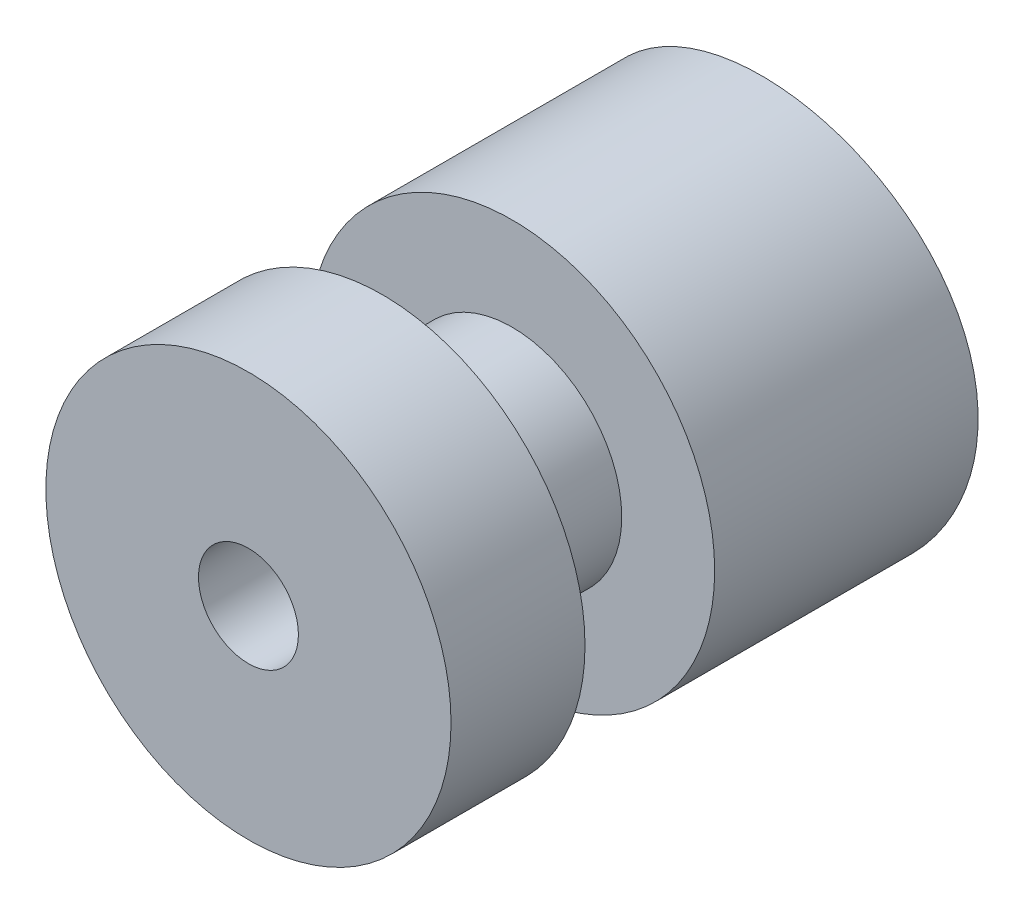
ISO-10303-21;
HEADER;
FILE_DESCRIPTION(('STEP AP214'),'2;1');
FILE_NAME('part.step','',(''),(''),'','','');
FILE_SCHEMA(('AUTOMOTIVE_DESIGN { 1 0 10303 214 1 1 1 1 }'));
ENDSEC;
DATA;
#1=APPLICATION_CONTEXT('core data for automotive mechanical design processes');
#2=APPLICATION_PROTOCOL_DEFINITION('international standard','automotive_design',2000,#1);
#3=PRODUCT_CONTEXT('',#1,'mechanical');
#4=PRODUCT('Part','Part','',(#3));
#5=PRODUCT_RELATED_PRODUCT_CATEGORY('part','',(#4));
#6=PRODUCT_DEFINITION_FORMATION('','',#4);
#7=PRODUCT_DEFINITION_CONTEXT('part definition',#1,'design');
#8=PRODUCT_DEFINITION('design','',#6,#7);
#9=PRODUCT_DEFINITION_SHAPE('','',#8);
#10=(LENGTH_UNIT() NAMED_UNIT(*) SI_UNIT(.MILLI.,.METRE.));
#11=(NAMED_UNIT(*) PLANE_ANGLE_UNIT() SI_UNIT($,.RADIAN.));
#12=(NAMED_UNIT(*) SI_UNIT($,.STERADIAN.) SOLID_ANGLE_UNIT());
#13=UNCERTAINTY_MEASURE_WITH_UNIT(LENGTH_MEASURE(1.E-05),#10,'distance_accuracy_value','');
#14=(GEOMETRIC_REPRESENTATION_CONTEXT(3) GLOBAL_UNCERTAINTY_ASSIGNED_CONTEXT((#13)) GLOBAL_UNIT_ASSIGNED_CONTEXT((#10,
#11,#12)) REPRESENTATION_CONTEXT('',''));
#15=CARTESIAN_POINT('',(0.,0.,0.));
#16=DIRECTION('',(0.,0.,1.));
#17=DIRECTION('',(1.,0.,0.));
#18=AXIS2_PLACEMENT_3D('',#15,#16,#17);
#19=CARTESIAN_POINT('',(0.,0.,24.78278));
#20=DIRECTION('',(0.,0.,-1.));
#21=DIRECTION('',(-1.,0.,0.));
#22=AXIS2_PLACEMENT_3D('',#19,#20,#21);
#23=CYLINDRICAL_SURFACE('',#22,9.525);
#24=CARTESIAN_POINT('',(-9.52499999999999,0.,0.));
#25=CARTESIAN_POINT('',(-9.52500330048905,-0.266266854005191,-1.23946684333722E-06));
#26=CARTESIAN_POINT('',(-9.51383108277556,-0.532486253668475,0.00153994071775043));
#27=CARTESIAN_POINT('',(-9.4692296761848,-1.06310273244726,0.00765771411403192));
#28=CARTESIAN_POINT('',(-9.43579559615122,-1.32749939818875,0.0122349743823779));
#29=CARTESIAN_POINT('',(-9.34687367997087,-1.85272621333056,0.0242999330053962));
#30=CARTESIAN_POINT('',(-9.2913661525161,-2.11355296258781,0.0317902298935934));
#31=CARTESIAN_POINT('',(-9.15871282916754,-2.62955630977296,0.0494644271780281));
#32=CARTESIAN_POINT('',(-9.08156668835782,-2.88473281756699,0.0596483705103974));
#33=CARTESIAN_POINT('',(-8.90627134656277,-3.38744247219539,0.0824087516421701));
#34=CARTESIAN_POINT('',(-8.80813772549415,-3.6349811338019,0.0949834139425913));
#35=CARTESIAN_POINT('',(-8.59154635824059,-4.1208872112801,0.122171539302804));
#36=CARTESIAN_POINT('',(-8.47308835424092,-4.35925451076611,0.136785028224668));
#37=CARTESIAN_POINT('',(-8.2167408639379,-4.82508545874511,0.167631338516708));
#38=CARTESIAN_POINT('',(-8.07885787775121,-5.05255272069676,0.183863617667915));
#39=CARTESIAN_POINT('',(-7.78455604814082,-5.49517682759171,0.217500132751496));
#40=CARTESIAN_POINT('',(-7.62813115682775,-5.71032962175493,0.234904750266667));
#41=CARTESIAN_POINT('',(-7.29691796939915,-6.12797308288935,0.270496229994959));
#42=CARTESIAN_POINT('',(-7.12202888699115,-6.33038349222168,0.28868702761889));
#43=CARTESIAN_POINT('',(-6.75586114837706,-6.71977620665679,0.325243053407828));
#44=CARTESIAN_POINT('',(-6.56458244059568,-6.90675846320621,0.343608282121576));
#45=CARTESIAN_POINT('',(-6.16691824199461,-7.26403510570452,0.380000665686484));
#46=CARTESIAN_POINT('',(-5.96052932874264,-7.43432569046701,0.398027742778215));
#47=CARTESIAN_POINT('',(-5.53418863768816,-7.75692043619742,0.433226659775958));
#48=CARTESIAN_POINT('',(-5.31424162948714,-7.90923086805486,0.450398796641692));
#49=CARTESIAN_POINT('',(-4.86130890845572,-8.19544772125475,0.483480548634547));
#50=CARTESIAN_POINT('',(-4.62827299833442,-8.32927536249283,0.499384644243813));
#51=CARTESIAN_POINT('',(-4.15163613550505,-8.57680921086481,0.529399680025324));
#52=CARTESIAN_POINT('',(-3.90803514591928,-8.69051534775702,0.543510613937814));
#53=CARTESIAN_POINT('',(-3.41200254889603,-8.89696736429671,0.569537472613483));
#54=CARTESIAN_POINT('',(-3.15957124315381,-8.98971395923868,0.581453472281475));
#55=CARTESIAN_POINT('',(-2.64767440125134,-9.15356022227428,0.602751013335545));
#56=CARTESIAN_POINT('',(-2.38820891208658,-9.22466003495164,0.612132571649679));
#57=CARTESIAN_POINT('',(-1.86574302502553,-9.34430320229504,0.628043217917806));
#58=CARTESIAN_POINT('',(-1.602774648083,-9.39298409302451,0.634589683466286));
#59=CARTESIAN_POINT('',(-1.07362022856637,-9.46807129802539,0.644729106316288));
#60=CARTESIAN_POINT('',(-0.807434197968627,-9.49447769517832,0.648322074607524));
#61=CARTESIAN_POINT('',(-0.273771712477416,-9.52481497777159,0.652452417421326));
#62=CARTESIAN_POINT('',(-0.00629531093223414,-9.52874678455103,0.652989917201905));
#63=CARTESIAN_POINT('',(0.52802889360886,-9.51410736257491,0.650994370261939));
#64=CARTESIAN_POINT('',(0.794876698839182,-9.49553621392972,0.648461334472482));
#65=CARTESIAN_POINT('',(1.32425337485495,-9.43623049894585,0.640423594732199));
#66=CARTESIAN_POINT('',(1.58679916508554,-9.39564411755528,0.634938761301742));
#67=CARTESIAN_POINT('',(2.10751270804583,-9.29270946921216,0.621163921901334));
#68=CARTESIAN_POINT('',(2.36568048333808,-9.23036131444696,0.612873930392674));
#69=CARTESIAN_POINT('',(2.87577891027634,-9.08437601446301,0.593721792626805));
#70=CARTESIAN_POINT('',(3.1277106005358,-9.00074244084384,0.582860077914716));
#71=CARTESIAN_POINT('',(3.62371517264379,-8.81275665504933,0.558861541802498));
#72=CARTESIAN_POINT('',(3.86778510900159,-8.70839678010276,0.545723879186264));
#73=CARTESIAN_POINT('',(4.34698837635089,-8.47938949981333,0.517499019204946));
#74=CARTESIAN_POINT('',(4.58209305192908,-8.35468283533033,0.502406154675639));
#75=CARTESIAN_POINT('',(5.04097924885162,-8.08608902897244,0.470721205247794));
#76=CARTESIAN_POINT('',(5.26476044928881,-7.94220134392716,0.454129077897244));
#77=CARTESIAN_POINT('',(5.69946237914339,-7.6362555041895,0.41990649857446));
#78=CARTESIAN_POINT('',(5.91038268868561,-7.47419675674826,0.40227601273938));
#79=CARTESIAN_POINT('',(6.31791065135557,-7.13303918951877,0.366466762636895));
#80=CARTESIAN_POINT('',(6.51451822673205,-6.95394027717518,0.348287995391812));
#81=CARTESIAN_POINT('',(6.89361293120586,-6.57841072058257,0.311738852511906));
#82=CARTESIAN_POINT('',(7.07597186686729,-6.38185067513572,0.293368123066115));
#83=CARTESIAN_POINT('',(7.42349211413347,-5.97404040012362,0.257103280756422));
#84=CARTESIAN_POINT('',(7.58865377302272,-5.76279046735198,0.239209158273276));
#85=CARTESIAN_POINT('',(7.90065119399891,-5.32702159784706,0.204401898209382));
#86=CARTESIAN_POINT('',(8.04748316094256,-5.1024999273475,0.187488964169396));
#87=CARTESIAN_POINT('',(8.32168099513047,-4.64188126603034,0.155137372109688));
#88=CARTESIAN_POINT('',(8.44905413298088,-4.40578864235411,0.139698164259176));
#89=CARTESIAN_POINT('',(8.68356766878404,-3.92342321941065,0.110719266163052));
#90=CARTESIAN_POINT('',(8.79069259643167,-3.67714281003216,0.0971810303374301));
#91=CARTESIAN_POINT('',(8.98380108553784,-3.17631429931234,0.0724099923679388));
#92=CARTESIAN_POINT('',(9.06978461933698,-2.92176618715482,0.0611771932402882));
#93=CARTESIAN_POINT('',(9.21996434291876,-2.40623370943145,0.0413448059967151));
#94=CARTESIAN_POINT('',(9.2841615623795,-2.14524964867086,0.0327450934361255));
#95=CARTESIAN_POINT('',(9.39028808729185,-1.61871505386141,0.0184301915488332));
#96=CARTESIAN_POINT('',(9.43221755180217,-1.35316455244464,0.0127149816181253));
#97=CARTESIAN_POINT('',(9.49324288188908,-0.821565776551121,0.00437072985664759));
#98=CARTESIAN_POINT('',(9.51251927852126,-0.555538596540414,0.00171729071043716));
#99=CARTESIAN_POINT('',(9.52870004046934,-0.0227924903889581,-0.000508918703824492));
#100=CARTESIAN_POINT('',(9.52560452474644,0.243926432065956,-8.17053530467806E-05));
#101=CARTESIAN_POINT('',(9.49706542951605,0.776136218567404,0.00384092124911964));
#102=CARTESIAN_POINT('',(9.47162239299174,1.0416271122941,0.00733625995351437));
#103=CARTESIAN_POINT('',(9.39858123422535,1.56948664764881,0.0172936269498102));
#104=CARTESIAN_POINT('',(9.35098312759764,1.83185529147718,0.0237556531508608));
#105=CARTESIAN_POINT('',(9.23423876421166,2.35049195754395,0.0394259292558263));
#106=CARTESIAN_POINT('',(9.16518521354824,2.60678121537523,0.0486223569558561));
#107=CARTESIAN_POINT('',(9.00594489643362,3.11270569655107,0.0695125643802645));
#108=CARTESIAN_POINT('',(8.91575040825556,3.36233845141416,0.0812072564570168));
#109=CARTESIAN_POINT('',(8.7149137670981,3.85307426982062,0.106757751918295));
#110=CARTESIAN_POINT('',(8.60427497728431,4.09417872854015,0.120613199791837));
#111=CARTESIAN_POINT('',(8.36332847061033,4.56624465805669,0.150096100675032));
#112=CARTESIAN_POINT('',(8.23302016830002,4.79720582668109,0.165723606425377));
#113=CARTESIAN_POINT('',(7.9527822004481,5.24880355081053,0.198414100416886));
#114=CARTESIAN_POINT('',(7.80273506452429,5.46936660913829,0.215485444944591));
#115=CARTESIAN_POINT('',(7.48471426207743,5.89709251789821,0.250496761908541));
#116=CARTESIAN_POINT('',(7.31674053293936,6.10425532152115,0.26843673737867));
#117=CARTESIAN_POINT('',(6.96402745532808,6.50376457319082,0.304682424227916));
#118=CARTESIAN_POINT('',(6.77928722791784,6.69611024351224,0.32298815474145));
#119=CARTESIAN_POINT('',(6.39433028850826,7.06464197178898,0.35945167629029));
#120=CARTESIAN_POINT('',(6.19411387212684,7.24082833827021,0.377609470144084));
#121=CARTESIAN_POINT('',(5.77811986533307,7.57700290773927,0.413395863501658));
#122=CARTESIAN_POINT('',(5.56224267205149,7.73686837985749,0.43101983907227));
#123=CARTESIAN_POINT('',(5.11777897819594,8.0377833614627,0.465098285039795));
#124=CARTESIAN_POINT('',(4.88919718750373,8.17883977883686,0.481553183753403));
#125=CARTESIAN_POINT('',(4.42081376415582,8.44121425482891,0.512837153965773));
#126=CARTESIAN_POINT('',(4.18101022366611,8.56252894129959,0.527665947563612));
#127=CARTESIAN_POINT('',(3.69191338088241,8.78450463556745,0.555273200982714));
#128=CARTESIAN_POINT('',(3.44262012577251,8.88516574604103,0.56805167099681));
#129=CARTESIAN_POINT('',(2.93711265237649,9.06480668823514,0.591158008380643));
#130=CARTESIAN_POINT('',(2.68092261163273,9.14385357639735,0.601493441240506));
#131=CARTESIAN_POINT('',(2.16270232068971,9.28009273037924,0.619471696271569));
#132=CARTESIAN_POINT('',(1.90067207817144,9.33728502494015,0.627114521983847));
#133=CARTESIAN_POINT('',(1.37266733397348,9.42938087748184,0.639489611328428));
#134=CARTESIAN_POINT('',(1.10669301189711,9.46428544721892,0.644222007079996));
#135=CARTESIAN_POINT('',(0.57271240862071,9.51154384779604,0.65064167339678));
#136=CARTESIAN_POINT('',(0.304706139428368,9.52389781179359,0.652328961942837));
#137=CARTESIAN_POINT('',(-0.229217088821525,9.5259527418773,0.652609201576571));
#138=CARTESIAN_POINT('',(-0.495133348478964,9.51583677388594,0.651227158982856));
#139=CARTESIAN_POINT('',(-1.02515426850516,9.47340295712098,0.645458860791217));
#140=CARTESIAN_POINT('',(-1.28925893936102,9.44108523698078,0.641072622599121));
#141=CARTESIAN_POINT('',(-1.81377657559602,9.3544905880099,0.629419143485465));
#142=CARTESIAN_POINT('',(-2.07418955859421,9.30021376401844,0.622151916318597));
#143=CARTESIAN_POINT('',(-2.5894828700873,9.17010457319378,0.604940113323883));
#144=CARTESIAN_POINT('',(-2.84436318621112,9.09427215816753,0.594995531510127));
#145=CARTESIAN_POINT('',(-3.34662844778373,8.92166863380028,0.572714569674252));
#146=CARTESIAN_POINT('',(-3.5940183879479,8.82491184411102,0.560379825963026));
#147=CARTESIAN_POINT('',(-4.07984817245256,8.61109320354978,0.53365274045702));
#148=CARTESIAN_POINT('',(-4.31828487609307,8.49402430687146,0.519259684986398));
#149=CARTESIAN_POINT('',(-4.78443312326207,8.24046179297916,0.48882122269089));
#150=CARTESIAN_POINT('',(-5.01214641918269,8.1039713643466,0.472776087219887));
#151=CARTESIAN_POINT('',(-5.45533012585301,7.81251175156655,0.439475641271438));
#152=CARTESIAN_POINT('',(-5.67080043953952,7.65754242094727,0.42222032120199));
#153=CARTESIAN_POINT('',(-6.08968298587766,7.32890258824517,0.386836697317378));
#154=CARTESIAN_POINT('',(-6.29298597278051,7.15509345203713,0.368702552923231));
#155=CARTESIAN_POINT('',(-6.68418747980417,6.79106979052454,0.332204777475231));
#156=CARTESIAN_POINT('',(-6.87209085629858,6.60086047626107,0.313841220889771));
#157=CARTESIAN_POINT('',(-7.23133322647646,6.20522905772374,0.277387971604345));
#158=CARTESIAN_POINT('',(-7.40266552763116,5.99980086569091,0.259298392021938));
#159=CARTESIAN_POINT('',(-7.72747873147153,5.57522547115774,0.22391163256895));
#160=CARTESIAN_POINT('',(-7.88095985511807,5.35607843852009,0.206614442891818));
#161=CARTESIAN_POINT('',(-8.16965548207873,4.90453795662053,0.173225644747842));
#162=CARTESIAN_POINT('',(-8.30478211780242,4.67208787258552,0.157139989126767));
#163=CARTESIAN_POINT('',(-8.55494561534309,4.19651296205123,0.126726757906897));
#164=CARTESIAN_POINT('',(-8.66998279086942,3.95338830231626,0.112399154856063));
#165=CARTESIAN_POINT('',(-8.87902822614219,3.45840718930947,0.0859294034209729));
#166=CARTESIAN_POINT('',(-8.9730561483512,3.2065591573925,0.0737852136877414));
#167=CARTESIAN_POINT('',(-9.13949831249253,2.6958023102074,0.0520214742842298));
#168=CARTESIAN_POINT('',(-9.21191754532343,2.43689514046914,0.04240134170157));
#169=CARTESIAN_POINT('',(-9.35677118831108,1.81935286777272,0.0230005380003741));
#170=CARTESIAN_POINT('',(-9.41978962676028,1.45842984927885,0.0144135024429494));
#171=CARTESIAN_POINT('',(-9.50390156166065,0.731641338005134,0.00291411239068896));
#172=CARTESIAN_POINT('',(-9.52499546605475,0.365775893352001,1.70267941759292E-06));
#173=CARTESIAN_POINT('',(-9.52499999999999,0.,0.));
#174=B_SPLINE_CURVE_WITH_KNOTS('',3,(#24,#25,#26,#27,#28,#29,#30,#31,#32,#33,#34,#35,#36,#37,
#38,#39,#40,#41,#42,#43,#44,#45,#46,#47,#48,#49,#50,#51,#52,#53,#54,#55,#56,#57,#58,#59,#60,#61,
#62,#63,#64,#65,#66,#67,#68,#69,#70,#71,#72,#73,#74,#75,#76,#77,#78,#79,#80,#81,#82,#83,#84,#85,
#86,#87,#88,#89,#90,#91,#92,#93,#94,#95,#96,#97,#98,#99,#100,#101,#102,#103,#104,#105,#106,#107,
#108,#109,#110,#111,#112,#113,#114,#115,#116,#117,#118,#119,#120,#121,#122,#123,#124,#125,#126,
#127,#128,#129,#130,#131,#132,#133,#134,#135,#136,#137,#138,#139,#140,#141,#142,#143,#144,#145,
#146,#147,#148,#149,#150,#151,#152,#153,#154,#155,#156,#157,#158,#159,#160,#161,#162,#163,#164,
#165,#166,#167,#168,#169,#170,#171,#172,#173),.UNSPECIFIED.,.T.,.F.,(4,2,2,2,2,2,2,2,2,2,2,2,2,
2,2,2,2,2,2,2,2,2,2,2,2,2,2,2,2,2,2,2,2,2,2,2,2,2,2,2,2,2,2,2,2,2,2,2,2,2,2,2,2,2,2,2,2,2,2,2,2,
2,2,2,2,2,2,2,2,2,2,2,2,2,4),(0.,0.798480267257828,1.59713602662085,2.39650585583218,
3.1958884275907,3.99467963011361,4.7934809660501,5.5920156338919,6.39081148351263,
7.19421818391016,7.99762741258183,8.80121917823472,9.60452984410413,10.4111652749888,
11.2178035216826,12.0244142357589,12.8310195621825,13.6326083382131,14.4341941315859,
15.2357470639533,16.0372971428059,16.8335177377808,17.6297342281019,18.4258172047833,
19.2221950529778,20.0209351358274,20.8196978422988,21.6184866123815,22.4172797214117,
23.2225854208489,24.0278748546621,24.833330747226,25.6384849489106,26.4442518503012,
27.2500198058754,28.0557496734467,28.8614737856074,29.6607322632564,30.4599864909032,
31.2592212994115,32.0584555446391,32.8542833342385,33.6504022541226,34.4463903258107,
35.2424020942336,36.0433857080198,36.8443721196181,37.6454005449807,38.4464136733044,
39.2530643782303,40.0594180086686,40.8659092306606,41.672396443196,42.4763524466263,
43.2803073927607,44.0842258405837,44.8881395413891,45.6855276781915,46.4829111950937,
47.2802909050978,48.0776723978628,48.8745099176441,49.6716243967982,50.4686081582465,
51.2655982373533,52.0689123274061,52.8719721041207,53.6753548684911,54.4787276875761,
55.2858202443643,56.0929001967762,56.8992216131369,57.7053566512799,58.8022550095971,
59.8991426945903),.UNSPECIFIED.);
#175=CARTESIAN_POINT('',(-9.52499999999999,0.,0.));
#176=VERTEX_POINT('',#175);
#177=EDGE_CURVE('E101',#176,#176,#174,.T.);
#178=ORIENTED_EDGE('',*,*,#177,.T.);
#179=EDGE_LOOP('',(#178));
#180=FACE_BOUND('',#179,.T.);
#181=CARTESIAN_POINT('',(0.,0.,12.38758));
#182=DIRECTION('',(0.,0.,1.));
#183=DIRECTION('',(1.,0.,0.));
#184=AXIS2_PLACEMENT_3D('',#181,#182,#183);
#185=CIRCLE('',#184,9.525);
#186=CARTESIAN_POINT('',(9.525,0.,12.38758));
#187=VERTEX_POINT('',#186);
#188=EDGE_CURVE('E52',#187,#187,#185,.T.);
#189=ORIENTED_EDGE('',*,*,#188,.F.);
#190=EDGE_LOOP('',(#189));
#191=FACE_BOUND('',#190,.T.);
#192=ADVANCED_FACE('F31',(#180,#191),#23,.T.);
#193=CARTESIAN_POINT('',(0.,0.,24.78278));
#194=DIRECTION('',(0.,0.,1.));
#195=DIRECTION('',(1.,0.,0.));
#196=AXIS2_PLACEMENT_3D('',#193,#194,#195);
#197=PLANE('',#196);
#198=CARTESIAN_POINT('',(0.,0.,24.78278));
#199=DIRECTION('',(0.,0.,1.));
#200=DIRECTION('',(1.,0.,0.));
#201=AXIS2_PLACEMENT_3D('',#198,#199,#200);
#202=CIRCLE('',#201,9.525);
#203=CARTESIAN_POINT('',(9.525,0.,24.78278));
#204=VERTEX_POINT('',#203);
#205=EDGE_CURVE('E43',#204,#204,#202,.T.);
#206=ORIENTED_EDGE('',*,*,#205,.T.);
#207=EDGE_LOOP('',(#206));
#208=FACE_BOUND('',#207,.T.);
#209=CARTESIAN_POINT('',(0.,0.,24.78278));
#210=DIRECTION('',(0.,0.,1.));
#211=DIRECTION('',(1.,0.,0.));
#212=AXIS2_PLACEMENT_3D('',#209,#210,#211);
#213=CIRCLE('',#212,2.3495);
#214=CARTESIAN_POINT('',(2.3495,0.,24.78278));
#215=VERTEX_POINT('',#214);
#216=EDGE_CURVE('E47',#215,#215,#213,.T.);
#217=ORIENTED_EDGE('',*,*,#216,.F.);
#218=EDGE_LOOP('',(#217));
#219=FACE_BOUND('',#218,.T.);
#220=ADVANCED_FACE('F65',(#208,#219),#197,.T.);
#221=CARTESIAN_POINT('',(0.,0.,18.48358));
#222=DIRECTION('',(0.,0.,1.));
#223=DIRECTION('',(1.,0.,0.));
#224=AXIS2_PLACEMENT_3D('',#221,#222,#223);
#225=CIRCLE('',#224,9.525);
#226=CARTESIAN_POINT('',(9.525,0.,18.48358));
#227=VERTEX_POINT('',#226);
#228=EDGE_CURVE('E56',#227,#227,#225,.T.);
#229=ORIENTED_EDGE('',*,*,#228,.T.);
#230=EDGE_LOOP('',(#229));
#231=FACE_BOUND('',#230,.T.);
#232=ORIENTED_EDGE('',*,*,#205,.F.);
#233=EDGE_LOOP('',(#232));
#234=FACE_BOUND('',#233,.T.);
#235=ADVANCED_FACE('F33',(#231,#234),#23,.T.);
#236=CARTESIAN_POINT('',(0.,0.,24.78278));
#237=DIRECTION('',(0.,0.,-1.));
#238=DIRECTION('',(-1.,0.,0.));
#239=AXIS2_PLACEMENT_3D('',#236,#237,#238);
#240=CYLINDRICAL_SURFACE('',#239,2.3495);
#241=CARTESIAN_POINT('',(-2.3495,0.,0.612953770108956));
#242=CARTESIAN_POINT('',(-2.34949416161972,-0.131932388935063,0.612954303087673));
#243=CARTESIAN_POINT('',(-2.33835001943243,-0.263959491187963,0.613331789609442));
#244=CARTESIAN_POINT('',(-2.29405000991487,-0.524374852539305,0.614801298206872));
#245=CARTESIAN_POINT('',(-2.26086790113736,-0.652758583072394,0.6158941720992));
#246=CARTESIAN_POINT('',(-2.1734401113365,-0.902076926681057,0.61867051639036));
#247=CARTESIAN_POINT('',(-2.11920479744077,-1.02301517219367,0.620353696068459));
#248=CARTESIAN_POINT('',(-1.99122516220538,-1.25403698936221,0.624120620377631));
#249=CARTESIAN_POINT('',(-1.91748558045006,-1.3641231891824,0.626204267660526));
#250=CARTESIAN_POINT('',(-1.7525448336332,-1.57040876029042,0.630538641405352));
#251=CARTESIAN_POINT('',(-1.66133568468442,-1.66660174675053,0.63278944397099));
#252=CARTESIAN_POINT('',(-1.46405938010862,-1.84231641829977,0.637203755481535));
#253=CARTESIAN_POINT('',(-1.35799163095455,-1.92183743710988,0.639367260934908));
#254=CARTESIAN_POINT('',(-1.13398267165989,-2.06196289371301,0.643363543620888));
#255=CARTESIAN_POINT('',(-1.01603887239313,-2.12256319469473,0.645196248490607));
#256=CARTESIAN_POINT('',(-0.771644196552327,-2.22310018907152,0.648323705715161));
#257=CARTESIAN_POINT('',(-0.645193358457972,-2.26303697592625,0.649618460503102));
#258=CARTESIAN_POINT('',(-0.387425148534633,-2.32109871377198,0.651523634203086));
#259=CARTESIAN_POINT('',(-0.256109651600699,-2.33923197976426,0.652134313988224));
#260=CARTESIAN_POINT('',(0.00770281809421412,-2.35319756633105,0.652603376757146));
#261=CARTESIAN_POINT('',(0.140199785475636,-2.3490299883957,0.652461763164582));
#262=CARTESIAN_POINT('',(0.402557773243999,-2.31851917955417,0.651442424084434));
#263=CARTESIAN_POINT('',(0.53241983805777,-2.29218491820149,0.650564996338109));
#264=CARTESIAN_POINT('',(0.785878874784102,-2.2181021573315,0.648173252093001));
#265=CARTESIAN_POINT('',(0.909475831106304,-2.17035360452889,0.646658934009441));
#266=CARTESIAN_POINT('',(1.14692505416011,-2.05478738718074,0.643163553836636));
#267=CARTESIAN_POINT('',(1.26077532054176,-1.98696561560245,0.641182396247742));
#268=CARTESIAN_POINT('',(1.47547744475962,-1.83318121460987,0.636976585122034));
#269=CARTESIAN_POINT('',(1.57632926390247,-1.7472185311963,0.634751930860423));
#270=CARTESIAN_POINT('',(1.76222397056819,-1.55954171182255,0.63030851030999));
#271=CARTESIAN_POINT('',(1.84725900152141,-1.4578197936172,0.628089747484084));
#272=CARTESIAN_POINT('',(1.99904580453132,-1.24153945237723,0.623909362941718));
#273=CARTESIAN_POINT('',(2.06579757336952,-1.12698102708294,0.621947741270524));
#274=CARTESIAN_POINT('',(2.17912217978026,-0.888275107833836,0.618502909479286));
#275=CARTESIAN_POINT('',(2.22569475675633,-0.764127490067449,0.617019705537647));
#276=CARTESIAN_POINT('',(2.2973338668151,-0.509769315154431,0.614699209459419));
#277=CARTESIAN_POINT('',(2.32240047340238,-0.379558778731663,0.613861915115197));
#278=CARTESIAN_POINT('',(2.35030644106491,-0.116839343386727,0.612928051093653));
#279=CARTESIAN_POINT('',(2.35315668954099,0.0156683978481954,0.612831118593329));
#280=CARTESIAN_POINT('',(2.33657741054815,0.279280869757533,0.613387961551624));
#281=CARTESIAN_POINT('',(2.31714791580565,0.410385602492523,0.614041735907541));
#282=CARTESIAN_POINT('',(2.25656970286629,0.66744005386944,0.616025963836876));
#283=CARTESIAN_POINT('',(2.21542593754484,0.793390941011663,0.617356263097111));
#284=CARTESIAN_POINT('',(2.11259212739006,1.03659830201622,0.620543449011448));
#285=CARTESIAN_POINT('',(2.05090202994571,1.15385475361459,0.622400337013935));
#286=CARTESIAN_POINT('',(1.90869867171777,1.37639489534051,0.626432264796377));
#287=CARTESIAN_POINT('',(1.82817808091409,1.4816738993041,0.628607428345588));
#288=CARTESIAN_POINT('',(1.6506101768669,1.67722357569025,0.633030268053233));
#289=CARTESIAN_POINT('',(1.55356281228723,1.76749420149144,0.635277944436892));
#290=CARTESIAN_POINT('',(1.34564953478636,1.93050103502323,0.639593491911432));
#291=CARTESIAN_POINT('',(1.23477811454914,2.00323022040632,0.641661290781042));
#292=CARTESIAN_POINT('',(1.00239201796174,2.12904164845731,0.645382967202178));
#293=CARTESIAN_POINT('',(0.880877368842726,2.18212394139084,0.647036845812697));
#294=CARTESIAN_POINT('',(0.63068059588325,2.26712245773078,0.649743907398344));
#295=CARTESIAN_POINT('',(0.502000016217042,2.29904322221397,0.650797219242992));
#296=CARTESIAN_POINT('',(0.241102321302651,2.34082745658443,0.652184927530155));
#297=CARTESIAN_POINT('',(0.108885211587519,2.35069096097918,0.652519325097373));
#298=CARTESIAN_POINT('',(-0.155262292303076,2.34808017311285,0.652431519454737));
#299=CARTESIAN_POINT('',(-0.287192795995792,2.33561693414824,0.652009690629657));
#300=CARTESIAN_POINT('',(-0.54708762285456,2.28872920154737,0.650457692246047));
#301=CARTESIAN_POINT('',(-0.675051938211858,2.2543046646759,0.649327521293003));
#302=CARTESIAN_POINT('',(-0.923385643302938,2.16447325438844,0.646486116742133));
#303=CARTESIAN_POINT('',(-1.04375491288671,2.10906604913365,0.644774873954759));
#304=CARTESIAN_POINT('',(-1.27348085302233,1.97884532530039,0.640964087458653));
#305=CARTESIAN_POINT('',(-1.38283791290734,1.90403249313632,0.63886455748514));
#306=CARTESIAN_POINT('',(-1.58748738105564,1.73708940146882,0.63451263321495));
#307=CARTESIAN_POINT('',(-1.68277431190495,1.64495242935042,0.632260179881665));
#308=CARTESIAN_POINT('',(-1.85655425112697,1.44596237416321,0.627856353146161));
#309=CARTESIAN_POINT('',(-1.93504309914216,1.33910565622155,0.625705004887216));
#310=CARTESIAN_POINT('',(-2.07301556540791,1.11366150775228,0.621745157425441));
#311=CARTESIAN_POINT('',(-2.13248597682046,0.995066000055779,0.619936896823404));
#312=CARTESIAN_POINT('',(-2.23060197605557,0.749658787792613,0.616871392168594));
#313=CARTESIAN_POINT('',(-2.26927236297441,0.622857070263493,0.615613492276707));
#314=CARTESIAN_POINT('',(-2.31445769509756,0.412713532385875,0.614126346328291));
#315=CARTESIAN_POINT('',(-2.32758198975256,0.330735318083267,0.613688544766762));
#316=CARTESIAN_POINT('',(-2.34510497582793,0.16585054729568,0.613102089173046));
#317=CARTESIAN_POINT('',(-2.34950367050553,0.0829439911572582,0.612953435032919));
#318=CARTESIAN_POINT('',(-2.3495,0.,0.612953770108956));
#319=B_SPLINE_CURVE_WITH_KNOTS('',3,(#241,#242,#243,#244,#245,#246,#247,#248,#249,#250,#251,
#252,#253,#254,#255,#256,#257,#258,#259,#260,#261,#262,#263,#264,#265,#266,#267,#268,#269,#270,
#271,#272,#273,#274,#275,#276,#277,#278,#279,#280,#281,#282,#283,#284,#285,#286,#287,#288,#289,
#290,#291,#292,#293,#294,#295,#296,#297,#298,#299,#300,#301,#302,#303,#304,#305,#306,#307,#308,
#309,#310,#311,#312,#313,#314,#315,#316,#317,#318),.UNSPECIFIED.,.T.,.F.,(4,2,2,2,2,2,2,2,2,2,2,
2,2,2,2,2,2,2,2,2,2,2,2,2,2,2,2,2,2,2,2,2,2,2,2,2,2,2,4),(0.,0.395494407361557,
0.791460591340582,1.18723203845341,1.58290740036135,1.97876402594344,2.3746364685373,
2.77059540386678,3.16655254828545,3.56235864235434,3.95816293512916,4.35380714612637,
4.74945234161284,5.1451785431614,5.54090592266793,5.93682934735288,6.33275284173389,
6.72868144896525,7.12460870295928,7.52034191570338,7.91607454716108,8.31171695372001,
8.7073603733706,9.10315805959484,9.49895697528494,9.89491407874014,10.2908701691514,
10.6867412633613,11.0826117382506,11.4782862837796,11.8739616082755,12.2696431905982,
12.6653107788096,13.0611319941541,13.457051128825,13.8532446047915,14.2489646610212,
14.4976063868121,14.7462480197858),.UNSPECIFIED.);
#320=CARTESIAN_POINT('',(-2.3495,0.,0.612953770108956));
#321=VERTEX_POINT('',#320);
#322=EDGE_CURVE('E11',#321,#321,#319,.T.);
#323=ORIENTED_EDGE('',*,*,#322,.F.);
#324=EDGE_LOOP('',(#323));
#325=FACE_BOUND('',#324,.T.);
#326=ORIENTED_EDGE('',*,*,#216,.T.);
#327=EDGE_LOOP('',(#326));
#328=FACE_BOUND('',#327,.T.);
#329=ADVANCED_FACE('F72',(#325,#328),#240,.F.);
#330=CARTESIAN_POINT('',(0.,0.,12.38758));
#331=DIRECTION('',(0.,0.,1.));
#332=DIRECTION('',(1.,0.,0.));
#333=AXIS2_PLACEMENT_3D('',#330,#331,#332);
#334=PLANE('',#333);
#335=CARTESIAN_POINT('',(0.,0.,12.38758));
#336=DIRECTION('',(0.,0.,1.));
#337=DIRECTION('',(1.,0.,0.));
#338=AXIS2_PLACEMENT_3D('',#335,#336,#337);
#339=CIRCLE('',#338,5.1562);
#340=CARTESIAN_POINT('',(5.1562,0.,12.38758));
#341=VERTEX_POINT('',#340);
#342=EDGE_CURVE('E58',#341,#341,#339,.T.);
#343=ORIENTED_EDGE('',*,*,#342,.F.);
#344=EDGE_LOOP('',(#343));
#345=FACE_BOUND('',#344,.T.);
#346=ORIENTED_EDGE('',*,*,#188,.T.);
#347=EDGE_LOOP('',(#346));
#348=FACE_BOUND('',#347,.T.);
#349=ADVANCED_FACE('F62',(#345,#348),#334,.T.);
#350=CARTESIAN_POINT('',(0.,0.,18.48358));
#351=DIRECTION('',(0.,0.,1.));
#352=DIRECTION('',(1.,0.,0.));
#353=AXIS2_PLACEMENT_3D('',#350,#351,#352);
#354=PLANE('',#353);
#355=CARTESIAN_POINT('',(0.,0.,18.48358));
#356=DIRECTION('',(0.,0.,1.));
#357=DIRECTION('',(1.,0.,0.));
#358=AXIS2_PLACEMENT_3D('',#355,#356,#357);
#359=CIRCLE('',#358,5.1562);
#360=CARTESIAN_POINT('',(5.1562,0.,18.48358));
#361=VERTEX_POINT('',#360);
#362=EDGE_CURVE('E105',#361,#361,#359,.T.);
#363=ORIENTED_EDGE('',*,*,#362,.T.);
#364=EDGE_LOOP('',(#363));
#365=FACE_BOUND('',#364,.T.);
#366=ORIENTED_EDGE('',*,*,#228,.F.);
#367=EDGE_LOOP('',(#366));
#368=FACE_BOUND('',#367,.T.);
#369=ADVANCED_FACE('F81',(#365,#368),#354,.F.);
#370=CARTESIAN_POINT('',(0.,0.,12.38758));
#371=DIRECTION('',(0.,0.,1.));
#372=DIRECTION('',(1.,0.,0.));
#373=AXIS2_PLACEMENT_3D('',#370,#371,#372);
#374=CYLINDRICAL_SURFACE('',#373,5.1562);
#375=CARTESIAN_POINT('',(5.1562,0.,12.38758));
#376=CARTESIAN_POINT('',(5.1562,0.,12.45108));
#377=CARTESIAN_POINT('',(5.1562,0.,12.51458));
#378=CARTESIAN_POINT('',(5.1562,0.,12.64158));
#379=CARTESIAN_POINT('',(5.1562,0.,12.70508));
#380=CARTESIAN_POINT('',(5.1562,0.,12.83208));
#381=CARTESIAN_POINT('',(5.1562,0.,12.89558));
#382=CARTESIAN_POINT('',(5.1562,0.,13.02258));
#383=CARTESIAN_POINT('',(5.1562,0.,13.08608));
#384=CARTESIAN_POINT('',(5.1562,0.,13.21308));
#385=CARTESIAN_POINT('',(5.1562,0.,13.27658));
#386=CARTESIAN_POINT('',(5.1562,0.,13.40358));
#387=CARTESIAN_POINT('',(5.1562,0.,13.46708));
#388=CARTESIAN_POINT('',(5.1562,0.,13.59408));
#389=CARTESIAN_POINT('',(5.1562,0.,13.65758));
#390=CARTESIAN_POINT('',(5.1562,0.,13.78458));
#391=CARTESIAN_POINT('',(5.1562,0.,13.84808));
#392=CARTESIAN_POINT('',(5.1562,0.,13.97508));
#393=CARTESIAN_POINT('',(5.1562,0.,14.03858));
#394=CARTESIAN_POINT('',(5.1562,0.,14.16558));
#395=CARTESIAN_POINT('',(5.1562,0.,14.22908));
#396=CARTESIAN_POINT('',(5.1562,0.,14.35608));
#397=CARTESIAN_POINT('',(5.1562,0.,14.41958));
#398=CARTESIAN_POINT('',(5.1562,0.,14.54658));
#399=CARTESIAN_POINT('',(5.1562,0.,14.61008));
#400=CARTESIAN_POINT('',(5.1562,0.,14.73708));
#401=CARTESIAN_POINT('',(5.1562,0.,14.80058));
#402=CARTESIAN_POINT('',(5.1562,0.,14.92758));
#403=CARTESIAN_POINT('',(5.1562,0.,14.99108));
#404=CARTESIAN_POINT('',(5.1562,0.,15.11808));
#405=CARTESIAN_POINT('',(5.1562,0.,15.18158));
#406=CARTESIAN_POINT('',(5.1562,0.,15.30858));
#407=CARTESIAN_POINT('',(5.1562,0.,15.37208));
#408=CARTESIAN_POINT('',(5.1562,0.,15.49908));
#409=CARTESIAN_POINT('',(5.1562,0.,15.56258));
#410=CARTESIAN_POINT('',(5.1562,0.,15.68958));
#411=CARTESIAN_POINT('',(5.1562,0.,15.75308));
#412=CARTESIAN_POINT('',(5.1562,0.,15.88008));
#413=CARTESIAN_POINT('',(5.1562,0.,15.94358));
#414=CARTESIAN_POINT('',(5.1562,0.,16.07058));
#415=CARTESIAN_POINT('',(5.1562,0.,16.13408));
#416=CARTESIAN_POINT('',(5.1562,0.,16.26108));
#417=CARTESIAN_POINT('',(5.1562,0.,16.32458));
#418=CARTESIAN_POINT('',(5.1562,0.,16.45158));
#419=CARTESIAN_POINT('',(5.1562,0.,16.51508));
#420=CARTESIAN_POINT('',(5.1562,0.,16.64208));
#421=CARTESIAN_POINT('',(5.1562,0.,16.70558));
#422=CARTESIAN_POINT('',(5.1562,0.,16.83258));
#423=CARTESIAN_POINT('',(5.1562,0.,16.89608));
#424=CARTESIAN_POINT('',(5.1562,0.,17.02308));
#425=CARTESIAN_POINT('',(5.1562,0.,17.08658));
#426=CARTESIAN_POINT('',(5.1562,0.,17.21358));
#427=CARTESIAN_POINT('',(5.1562,0.,17.27708));
#428=CARTESIAN_POINT('',(5.1562,0.,17.40408));
#429=CARTESIAN_POINT('',(5.1562,0.,17.46758));
#430=CARTESIAN_POINT('',(5.1562,0.,17.59458));
#431=CARTESIAN_POINT('',(5.1562,0.,17.65808));
#432=CARTESIAN_POINT('',(5.1562,0.,17.78508));
#433=CARTESIAN_POINT('',(5.1562,0.,17.84858));
#434=CARTESIAN_POINT('',(5.1562,0.,17.97558));
#435=CARTESIAN_POINT('',(5.1562,0.,18.03908));
#436=CARTESIAN_POINT('',(5.1562,0.,18.16608));
#437=CARTESIAN_POINT('',(5.1562,0.,18.22958));
#438=CARTESIAN_POINT('',(5.1562,0.,18.35658));
#439=CARTESIAN_POINT('',(5.1562,0.,18.42008));
#440=CARTESIAN_POINT('',(5.1562,0.,18.48358));
#441=B_SPLINE_CURVE_WITH_KNOTS('',3,(#375,#376,#377,#378,#379,#380,#381,#382,#383,#384,#385,
#386,#387,#388,#389,#390,#391,#392,#393,#394,#395,#396,#397,#398,#399,#400,#401,#402,#403,#404,
#405,#406,#407,#408,#409,#410,#411,#412,#413,#414,#415,#416,#417,#418,#419,#420,#421,#422,#423,
#424,#425,#426,#427,#428,#429,#430,#431,#432,#433,#434,#435,#436,#437,#438,#439,#440),
.UNSPECIFIED.,.F.,.F.,(4,2,2,2,2,2,2,2,2,2,2,2,2,2,2,2,2,2,2,2,2,2,2,2,2,2,2,2,2,2,2,2,4),(0.,
0.190500000000001,0.381000000000001,0.571500000000001,0.762000000000001,0.9525,1.143,1.3335,
1.524,1.7145,1.905,2.0955,2.286,2.4765,2.667,2.8575,3.048,3.2385,3.429,3.6195,3.81,4.0005,4.191,
4.3815,4.572,4.7625,4.953,5.1435,5.334,5.5245,5.715,5.9055,6.096),.UNSPECIFIED.);
#442=EDGE_CURVE('BSEAM83',#341,#361,#441,.T.);
#443=ORIENTED_EDGE('',*,*,#342,.T.);
#444=ORIENTED_EDGE('',*,*,#362,.F.);
#445=ORIENTED_EDGE('',*,*,#442,.T.);
#446=ORIENTED_EDGE('',*,*,#442,.F.);
#447=EDGE_LOOP('',(#443,#445,#444,#446));
#448=FACE_BOUND('',#447,.T.);
#449=ADVANCED_FACE('F83',(#448),#374,.T.);
#450=CARTESIAN_POINT('',(0.,45.7573625313525,-69.1975207287082));
#451=DIRECTION('',(0.,-1.,0.));
#452=DIRECTION('',(0.,0.,-1.));
#453=AXIS2_PLACEMENT_3D('',#450,#451,#452);
#454=CYLINDRICAL_SURFACE('',#453,69.85);
#455=ORIENTED_EDGE('',*,*,#322,.T.);
#456=EDGE_LOOP('',(#455));
#457=FACE_BOUND('',#456,.T.);
#458=ORIENTED_EDGE('',*,*,#177,.F.);
#459=EDGE_LOOP('',(#458));
#460=FACE_BOUND('',#459,.T.);
#461=ADVANCED_FACE('F90',(#457,#460),#454,.F.);
#462=CLOSED_SHELL('',(#192,#220,#235,#329,#349,#369,#449,#461));
#463=MANIFOLD_SOLID_BREP('B2',#462);
#464=ADVANCED_BREP_SHAPE_REPRESENTATION('',(#18,#463),#14);
#465=SHAPE_DEFINITION_REPRESENTATION(#9,#464);
ENDSEC;
END-ISO-10303-21;
